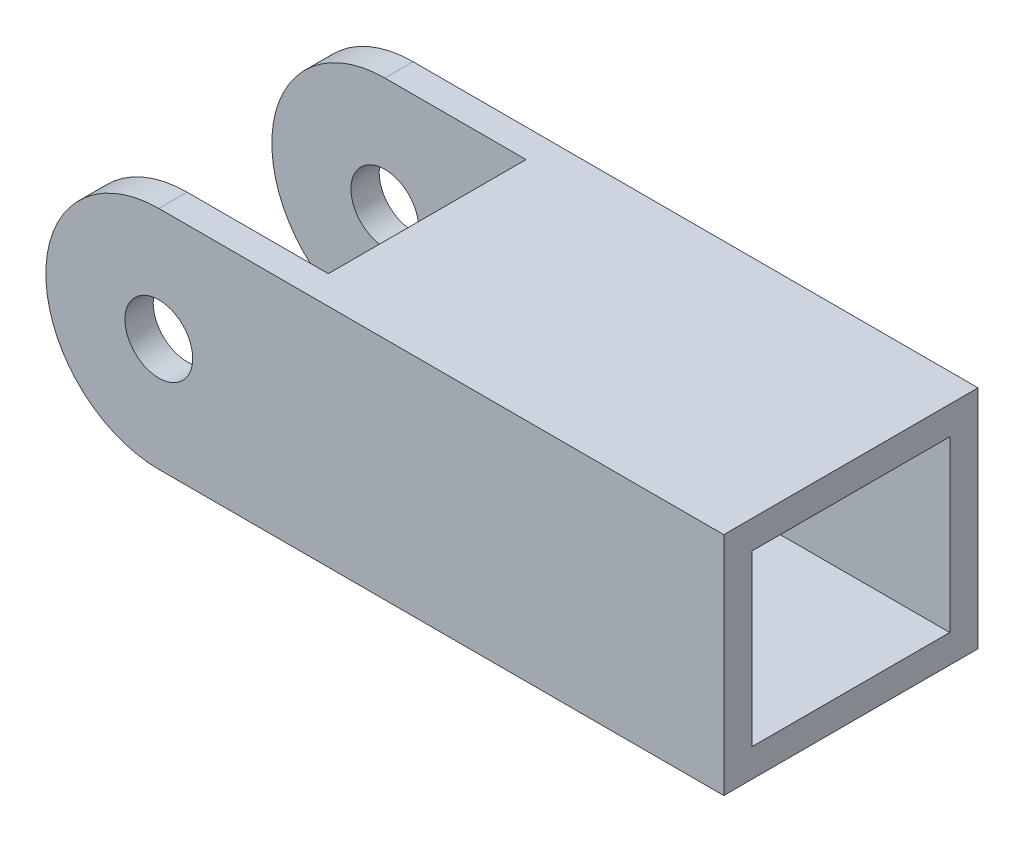
ISO-10303-21;
HEADER;
FILE_DESCRIPTION(('STEP AP214'),'2;1');
FILE_NAME('part.step','',(''),(''),'','','');
FILE_SCHEMA(('AUTOMOTIVE_DESIGN { 1 0 10303 214 1 1 1 1 }'));
ENDSEC;
DATA;
#1=APPLICATION_CONTEXT('core data for automotive mechanical design processes');
#2=APPLICATION_PROTOCOL_DEFINITION('international standard','automotive_design',2000,#1);
#3=PRODUCT_CONTEXT('',#1,'mechanical');
#4=PRODUCT('Part','Part','',(#3));
#5=PRODUCT_RELATED_PRODUCT_CATEGORY('part','',(#4));
#6=PRODUCT_DEFINITION_FORMATION('','',#4);
#7=PRODUCT_DEFINITION_CONTEXT('part definition',#1,'design');
#8=PRODUCT_DEFINITION('design','',#6,#7);
#9=PRODUCT_DEFINITION_SHAPE('','',#8);
#10=(LENGTH_UNIT() NAMED_UNIT(*) SI_UNIT(.MILLI.,.METRE.));
#11=(NAMED_UNIT(*) PLANE_ANGLE_UNIT() SI_UNIT($,.RADIAN.));
#12=(NAMED_UNIT(*) SI_UNIT($,.STERADIAN.) SOLID_ANGLE_UNIT());
#13=UNCERTAINTY_MEASURE_WITH_UNIT(LENGTH_MEASURE(1.E-05),#10,'distance_accuracy_value','');
#14=(GEOMETRIC_REPRESENTATION_CONTEXT(3) GLOBAL_UNCERTAINTY_ASSIGNED_CONTEXT((#13)) GLOBAL_UNIT_ASSIGNED_CONTEXT((#10,
#11,#12)) REPRESENTATION_CONTEXT('',''));
#15=CARTESIAN_POINT('',(0.,0.,0.));
#16=DIRECTION('',(0.,0.,1.));
#17=DIRECTION('',(1.,0.,0.));
#18=AXIS2_PLACEMENT_3D('',#15,#16,#17);
#19=CARTESIAN_POINT('',(-50.,0.,5.));
#20=DIRECTION('',(0.,0.,-1.));
#21=DIRECTION('',(-1.,0.,0.));
#22=AXIS2_PLACEMENT_3D('',#19,#20,#21);
#23=PLANE('',#22);
#24=CARTESIAN_POINT('',(-50.,0.,5.));
#25=DIRECTION('',(0.,0.,-1.));
#26=DIRECTION('',(-1.,0.,0.));
#27=AXIS2_PLACEMENT_3D('',#24,#25,#26);
#28=CIRCLE('',#27,5.99999999999999);
#29=CARTESIAN_POINT('',(-56.,0.,5.));
#30=VERTEX_POINT('',#29);
#31=EDGE_CURVE('E243',#30,#30,#28,.T.);
#32=ORIENTED_EDGE('',*,*,#31,.T.);
#33=EDGE_LOOP('',(#32));
#34=FACE_BOUND('',#33,.T.);
#35=DIRECTION('',(0.,-1.,0.));
#36=VECTOR('',#35,1.);
#37=CARTESIAN_POINT('',(-25.,-15.,5.));
#38=LINE('',#37,#36);
#39=CARTESIAN_POINT('',(-25.,-15.,5.));
#40=VERTEX_POINT('',#39);
#41=CARTESIAN_POINT('',(-25.,-20.,5.));
#42=VERTEX_POINT('',#41);
#43=EDGE_CURVE('E52',#40,#42,#38,.T.);
#44=ORIENTED_EDGE('',*,*,#43,.F.);
#45=DIRECTION('',(-1.,0.,0.));
#46=VECTOR('',#45,1.);
#47=CARTESIAN_POINT('',(50.,-15.,5.));
#48=LINE('',#47,#46);
#49=CARTESIAN_POINT('',(50.,-15.,5.));
#50=VERTEX_POINT('',#49);
#51=EDGE_CURVE('E240',#50,#40,#48,.T.);
#52=ORIENTED_EDGE('',*,*,#51,.F.);
#53=DIRECTION('',(0.,1.,0.));
#54=VECTOR('',#53,1.);
#55=CARTESIAN_POINT('',(50.,-20.,5.));
#56=LINE('',#55,#54);
#57=CARTESIAN_POINT('',(50.,15.,5.));
#58=VERTEX_POINT('',#57);
#59=EDGE_CURVE('E142',#50,#58,#56,.T.);
#60=ORIENTED_EDGE('',*,*,#59,.T.);
#61=DIRECTION('',(-1.,0.,0.));
#62=VECTOR('',#61,1.);
#63=CARTESIAN_POINT('',(50.,15.,5.));
#64=LINE('',#63,#62);
#65=CARTESIAN_POINT('',(-25.,15.,5.));
#66=VERTEX_POINT('',#65);
#67=EDGE_CURVE('E181',#58,#66,#64,.T.);
#68=ORIENTED_EDGE('',*,*,#67,.T.);
#69=DIRECTION('',(0.,1.,0.));
#70=VECTOR('',#69,1.);
#71=CARTESIAN_POINT('',(-25.,15.,5.));
#72=LINE('',#71,#70);
#73=CARTESIAN_POINT('',(-25.,20.,5.));
#74=VERTEX_POINT('',#73);
#75=EDGE_CURVE('E187',#66,#74,#72,.T.);
#76=ORIENTED_EDGE('',*,*,#75,.T.);
#77=DIRECTION('',(1.,0.,0.));
#78=VECTOR('',#77,1.);
#79=CARTESIAN_POINT('',(-50.,20.,5.));
#80=LINE('',#79,#78);
#81=CARTESIAN_POINT('',(-50.,20.,5.));
#82=VERTEX_POINT('',#81);
#83=EDGE_CURVE('E198',#82,#74,#80,.T.);
#84=ORIENTED_EDGE('',*,*,#83,.F.);
#85=CARTESIAN_POINT('',(-50.,0.,5.));
#86=DIRECTION('',(0.,0.,-1.));
#87=DIRECTION('',(-1.,0.,0.));
#88=AXIS2_PLACEMENT_3D('',#85,#86,#87);
#89=CIRCLE('',#88,20.);
#90=CARTESIAN_POINT('',(-50.,-20.,5.));
#91=VERTEX_POINT('',#90);
#92=EDGE_CURVE('E195',#91,#82,#89,.T.);
#93=ORIENTED_EDGE('',*,*,#92,.F.);
#94=DIRECTION('',(1.,0.,0.));
#95=VECTOR('',#94,1.);
#96=CARTESIAN_POINT('',(-50.,-20.,5.));
#97=LINE('',#96,#95);
#98=EDGE_CURVE('E57',#91,#42,#97,.T.);
#99=ORIENTED_EDGE('',*,*,#98,.T.);
#100=EDGE_LOOP('',(#44,#52,#60,#68,#76,#84,#93,#99));
#101=FACE_BOUND('',#100,.T.);
#102=ADVANCED_FACE('F35',(#34,#101),#23,.F.);
#103=CARTESIAN_POINT('',(-50.,0.,40.));
#104=DIRECTION('',(0.,0.,1.));
#105=DIRECTION('',(-1.,0.,0.));
#106=AXIS2_PLACEMENT_3D('',#103,#104,#105);
#107=PLANE('',#106);
#108=CARTESIAN_POINT('',(-50.,0.,40.));
#109=DIRECTION('',(0.,0.,1.));
#110=DIRECTION('',(1.,0.,0.));
#111=AXIS2_PLACEMENT_3D('',#108,#109,#110);
#112=CIRCLE('',#111,5.99999999999999);
#113=CARTESIAN_POINT('',(-56.,0.,40.));
#114=VERTEX_POINT('',#113);
#115=EDGE_CURVE('E248',#114,#114,#112,.T.);
#116=ORIENTED_EDGE('',*,*,#115,.T.);
#117=EDGE_LOOP('',(#116));
#118=FACE_BOUND('',#117,.T.);
#119=DIRECTION('',(0.,-1.,0.));
#120=VECTOR('',#119,1.);
#121=CARTESIAN_POINT('',(-25.,-15.,40.));
#122=LINE('',#121,#120);
#123=CARTESIAN_POINT('',(-25.,-15.,40.));
#124=VERTEX_POINT('',#123);
#125=CARTESIAN_POINT('',(-25.,-20.,40.));
#126=VERTEX_POINT('',#125);
#127=EDGE_CURVE('E238',#124,#126,#122,.T.);
#128=ORIENTED_EDGE('',*,*,#127,.T.);
#129=DIRECTION('',(1.,0.,0.));
#130=VECTOR('',#129,1.);
#131=CARTESIAN_POINT('',(-50.,-20.,40.));
#132=LINE('',#131,#130);
#133=CARTESIAN_POINT('',(-50.,-20.,40.));
#134=VERTEX_POINT('',#133);
#135=EDGE_CURVE('E150',#134,#126,#132,.T.);
#136=ORIENTED_EDGE('',*,*,#135,.F.);
#137=CARTESIAN_POINT('',(-50.,0.,40.));
#138=DIRECTION('',(0.,0.,-1.));
#139=DIRECTION('',(-1.,0.,0.));
#140=AXIS2_PLACEMENT_3D('',#137,#138,#139);
#141=CIRCLE('',#140,20.);
#142=CARTESIAN_POINT('',(-50.,20.,40.));
#143=VERTEX_POINT('',#142);
#144=EDGE_CURVE('E157',#134,#143,#141,.T.);
#145=ORIENTED_EDGE('',*,*,#144,.T.);
#146=DIRECTION('',(1.,0.,0.));
#147=VECTOR('',#146,1.);
#148=CARTESIAN_POINT('',(-50.,20.,40.));
#149=LINE('',#148,#147);
#150=CARTESIAN_POINT('',(-25.,20.,40.));
#151=VERTEX_POINT('',#150);
#152=EDGE_CURVE('E151',#143,#151,#149,.T.);
#153=ORIENTED_EDGE('',*,*,#152,.T.);
#154=DIRECTION('',(0.,1.,0.));
#155=VECTOR('',#154,1.);
#156=CARTESIAN_POINT('',(-25.,15.,40.));
#157=LINE('',#156,#155);
#158=CARTESIAN_POINT('',(-25.,15.,40.));
#159=VERTEX_POINT('',#158);
#160=EDGE_CURVE('E190',#159,#151,#157,.T.);
#161=ORIENTED_EDGE('',*,*,#160,.F.);
#162=DIRECTION('',(1.,0.,0.));
#163=VECTOR('',#162,1.);
#164=CARTESIAN_POINT('',(50.,15.,40.));
#165=LINE('',#164,#163);
#166=CARTESIAN_POINT('',(50.,15.,40.));
#167=VERTEX_POINT('',#166);
#168=EDGE_CURVE('E149',#159,#167,#165,.T.);
#169=ORIENTED_EDGE('',*,*,#168,.T.);
#170=DIRECTION('',(0.,1.,0.));
#171=VECTOR('',#170,1.);
#172=CARTESIAN_POINT('',(50.,-20.,40.));
#173=LINE('',#172,#171);
#174=CARTESIAN_POINT('',(50.,-15.,40.));
#175=VERTEX_POINT('',#174);
#176=EDGE_CURVE('E140',#175,#167,#173,.T.);
#177=ORIENTED_EDGE('',*,*,#176,.F.);
#178=DIRECTION('',(1.,0.,0.));
#179=VECTOR('',#178,1.);
#180=CARTESIAN_POINT('',(50.,-15.,40.));
#181=LINE('',#180,#179);
#182=EDGE_CURVE('E124',#124,#175,#181,.T.);
#183=ORIENTED_EDGE('',*,*,#182,.F.);
#184=EDGE_LOOP('',(#128,#136,#145,#153,#161,#169,#177,#183));
#185=FACE_BOUND('',#184,.T.);
#186=ADVANCED_FACE('F146',(#118,#185),#107,.F.);
#187=CARTESIAN_POINT('',(-50.,0.,5.));
#188=DIRECTION('',(0.,0.,-1.));
#189=DIRECTION('',(-1.,0.,0.));
#190=AXIS2_PLACEMENT_3D('',#187,#188,#189);
#191=CYLINDRICAL_SURFACE('',#190,20.);
#192=CARTESIAN_POINT('',(-50.,0.,0.));
#193=DIRECTION('',(0.,0.,-1.));
#194=DIRECTION('',(-1.,0.,0.));
#195=AXIS2_PLACEMENT_3D('',#192,#193,#194);
#196=CIRCLE('',#195,20.);
#197=CARTESIAN_POINT('',(-50.,-20.,0.));
#198=VERTEX_POINT('',#197);
#199=CARTESIAN_POINT('',(-50.,20.,0.));
#200=VERTEX_POINT('',#199);
#201=EDGE_CURVE('E192',#198,#200,#196,.T.);
#202=ORIENTED_EDGE('',*,*,#201,.F.);
#203=DIRECTION('',(0.,0.,-1.));
#204=VECTOR('',#203,1.);
#205=CARTESIAN_POINT('',(-50.,-20.,5.));
#206=LINE('',#205,#204);
#207=EDGE_CURVE('E11',#91,#198,#206,.T.);
#208=ORIENTED_EDGE('',*,*,#207,.F.);
#209=ORIENTED_EDGE('',*,*,#92,.T.);
#210=DIRECTION('',(0.,0.,-1.));
#211=VECTOR('',#210,1.);
#212=CARTESIAN_POINT('',(-50.,20.,5.));
#213=LINE('',#212,#211);
#214=EDGE_CURVE('E39',#82,#200,#213,.T.);
#215=ORIENTED_EDGE('',*,*,#214,.T.);
#216=EDGE_LOOP('',(#202,#208,#209,#215));
#217=FACE_BOUND('',#216,.T.);
#218=ADVANCED_FACE('F37',(#217),#191,.T.);
#219=CARTESIAN_POINT('',(-50.,-20.,5.));
#220=DIRECTION('',(0.,1.,0.));
#221=DIRECTION('',(0.,0.,1.));
#222=AXIS2_PLACEMENT_3D('',#219,#220,#221);
#223=PLANE('',#222);
#224=DIRECTION('',(1.,0.,0.));
#225=VECTOR('',#224,1.);
#226=CARTESIAN_POINT('',(-50.,-20.,0.));
#227=LINE('',#226,#225);
#228=CARTESIAN_POINT('',(50.,-20.,0.));
#229=VERTEX_POINT('',#228);
#230=EDGE_CURVE('E199',#198,#229,#227,.T.);
#231=ORIENTED_EDGE('',*,*,#230,.T.);
#232=DIRECTION('',(0.,0.,-1.));
#233=VECTOR('',#232,1.);
#234=CARTESIAN_POINT('',(50.,-20.,5.));
#235=LINE('',#234,#233);
#236=CARTESIAN_POINT('',(50.,-20.,45.));
#237=VERTEX_POINT('',#236);
#238=EDGE_CURVE('E44',#237,#229,#235,.T.);
#239=ORIENTED_EDGE('',*,*,#238,.F.);
#240=DIRECTION('',(1.,0.,0.));
#241=VECTOR('',#240,1.);
#242=CARTESIAN_POINT('',(-50.,-20.,45.));
#243=LINE('',#242,#241);
#244=CARTESIAN_POINT('',(-50.,-20.,45.));
#245=VERTEX_POINT('',#244);
#246=EDGE_CURVE('E170',#245,#237,#243,.T.);
#247=ORIENTED_EDGE('',*,*,#246,.F.);
#248=DIRECTION('',(0.,0.,1.));
#249=VECTOR('',#248,1.);
#250=CARTESIAN_POINT('',(-50.,-20.,40.));
#251=LINE('',#250,#249);
#252=EDGE_CURVE('E173',#134,#245,#251,.T.);
#253=ORIENTED_EDGE('',*,*,#252,.F.);
#254=ORIENTED_EDGE('',*,*,#135,.T.);
#255=DIRECTION('',(0.,0.,1.));
#256=VECTOR('',#255,1.);
#257=CARTESIAN_POINT('',(-25.,-20.,40.));
#258=LINE('',#257,#256);
#259=EDGE_CURVE('E143',#42,#126,#258,.T.);
#260=ORIENTED_EDGE('',*,*,#259,.F.);
#261=ORIENTED_EDGE('',*,*,#98,.F.);
#262=ORIENTED_EDGE('',*,*,#207,.T.);
#263=EDGE_LOOP('',(#231,#239,#247,#253,#254,#260,#261,#262));
#264=FACE_BOUND('',#263,.T.);
#265=ADVANCED_FACE('F226',(#264),#223,.F.);
#266=CARTESIAN_POINT('',(50.,-20.,5.));
#267=DIRECTION('',(-1.,0.,0.));
#268=DIRECTION('',(0.,0.,1.));
#269=AXIS2_PLACEMENT_3D('',#266,#267,#268);
#270=PLANE('',#269);
#271=ORIENTED_EDGE('',*,*,#59,.F.);
#272=DIRECTION('',(0.,0.,-1.));
#273=VECTOR('',#272,1.);
#274=CARTESIAN_POINT('',(50.,-15.,40.));
#275=LINE('',#274,#273);
#276=EDGE_CURVE('E127',#175,#50,#275,.T.);
#277=ORIENTED_EDGE('',*,*,#276,.F.);
#278=ORIENTED_EDGE('',*,*,#176,.T.);
#279=DIRECTION('',(0.,0.,-1.));
#280=VECTOR('',#279,1.);
#281=CARTESIAN_POINT('',(50.,15.,40.));
#282=LINE('',#281,#280);
#283=EDGE_CURVE('E179',#167,#58,#282,.T.);
#284=ORIENTED_EDGE('',*,*,#283,.T.);
#285=EDGE_LOOP('',(#271,#277,#278,#284));
#286=FACE_BOUND('',#285,.T.);
#287=DIRECTION('',(0.,1.,0.));
#288=VECTOR('',#287,1.);
#289=CARTESIAN_POINT('',(50.,-20.,0.));
#290=LINE('',#289,#288);
#291=CARTESIAN_POINT('',(50.,20.,0.));
#292=VERTEX_POINT('',#291);
#293=EDGE_CURVE('E209',#229,#292,#290,.T.);
#294=ORIENTED_EDGE('',*,*,#293,.T.);
#295=DIRECTION('',(0.,0.,-1.));
#296=VECTOR('',#295,1.);
#297=CARTESIAN_POINT('',(50.,20.,5.));
#298=LINE('',#297,#296);
#299=CARTESIAN_POINT('',(50.,20.,45.));
#300=VERTEX_POINT('',#299);
#301=EDGE_CURVE('E214',#300,#292,#298,.T.);
#302=ORIENTED_EDGE('',*,*,#301,.F.);
#303=DIRECTION('',(0.,1.,0.));
#304=VECTOR('',#303,1.);
#305=CARTESIAN_POINT('',(50.,-20.,45.));
#306=LINE('',#305,#304);
#307=EDGE_CURVE('E167',#237,#300,#306,.T.);
#308=ORIENTED_EDGE('',*,*,#307,.F.);
#309=ORIENTED_EDGE('',*,*,#238,.T.);
#310=EDGE_LOOP('',(#294,#302,#308,#309));
#311=FACE_BOUND('',#310,.T.);
#312=ADVANCED_FACE('F137',(#286,#311),#270,.F.);
#313=CARTESIAN_POINT('',(-50.,20.,5.));
#314=DIRECTION('',(0.,1.,0.));
#315=DIRECTION('',(0.,0.,1.));
#316=AXIS2_PLACEMENT_3D('',#313,#314,#315);
#317=PLANE('',#316);
#318=DIRECTION('',(1.,0.,0.));
#319=VECTOR('',#318,1.);
#320=CARTESIAN_POINT('',(-50.,20.,0.));
#321=LINE('',#320,#319);
#322=EDGE_CURVE('E206',#200,#292,#321,.T.);
#323=ORIENTED_EDGE('',*,*,#322,.F.);
#324=ORIENTED_EDGE('',*,*,#214,.F.);
#325=ORIENTED_EDGE('',*,*,#83,.T.);
#326=DIRECTION('',(0.,0.,1.));
#327=VECTOR('',#326,1.);
#328=CARTESIAN_POINT('',(-25.,20.,40.));
#329=LINE('',#328,#327);
#330=EDGE_CURVE('E176',#74,#151,#329,.T.);
#331=ORIENTED_EDGE('',*,*,#330,.T.);
#332=ORIENTED_EDGE('',*,*,#152,.F.);
#333=DIRECTION('',(0.,0.,1.));
#334=VECTOR('',#333,1.);
#335=CARTESIAN_POINT('',(-50.,20.,40.));
#336=LINE('',#335,#334);
#337=CARTESIAN_POINT('',(-50.,20.,45.));
#338=VERTEX_POINT('',#337);
#339=EDGE_CURVE('E154',#143,#338,#336,.T.);
#340=ORIENTED_EDGE('',*,*,#339,.T.);
#341=DIRECTION('',(1.,0.,0.));
#342=VECTOR('',#341,1.);
#343=CARTESIAN_POINT('',(-50.,20.,45.));
#344=LINE('',#343,#342);
#345=EDGE_CURVE('E164',#338,#300,#344,.T.);
#346=ORIENTED_EDGE('',*,*,#345,.T.);
#347=ORIENTED_EDGE('',*,*,#301,.T.);
#348=EDGE_LOOP('',(#323,#324,#325,#331,#332,#340,#346,#347));
#349=FACE_BOUND('',#348,.T.);
#350=ADVANCED_FACE('F220',(#349),#317,.T.);
#351=CARTESIAN_POINT('',(-50.,0.,0.));
#352=DIRECTION('',(0.,0.,-1.));
#353=DIRECTION('',(-1.,0.,0.));
#354=AXIS2_PLACEMENT_3D('',#351,#352,#353);
#355=PLANE('',#354);
#356=CARTESIAN_POINT('',(-50.,0.,0.));
#357=DIRECTION('',(0.,0.,-1.));
#358=DIRECTION('',(-1.,0.,0.));
#359=AXIS2_PLACEMENT_3D('',#356,#357,#358);
#360=CIRCLE('',#359,5.99999999999999);
#361=CARTESIAN_POINT('',(-56.,0.,0.));
#362=VERTEX_POINT('',#361);
#363=EDGE_CURVE('E252',#362,#362,#360,.T.);
#364=ORIENTED_EDGE('',*,*,#363,.F.);
#365=EDGE_LOOP('',(#364));
#366=FACE_BOUND('',#365,.T.);
#367=ORIENTED_EDGE('',*,*,#201,.T.);
#368=ORIENTED_EDGE('',*,*,#322,.T.);
#369=ORIENTED_EDGE('',*,*,#293,.F.);
#370=ORIENTED_EDGE('',*,*,#230,.F.);
#371=EDGE_LOOP('',(#367,#368,#369,#370));
#372=FACE_BOUND('',#371,.T.);
#373=ADVANCED_FACE('F224',(#366,#372),#355,.T.);
#374=CARTESIAN_POINT('',(-25.,15.,40.));
#375=DIRECTION('',(-1.,0.,0.));
#376=DIRECTION('',(0.,0.,1.));
#377=AXIS2_PLACEMENT_3D('',#374,#375,#376);
#378=PLANE('',#377);
#379=ORIENTED_EDGE('',*,*,#330,.F.);
#380=ORIENTED_EDGE('',*,*,#75,.F.);
#381=DIRECTION('',(0.,0.,1.));
#382=VECTOR('',#381,1.);
#383=CARTESIAN_POINT('',(-25.,15.,40.));
#384=LINE('',#383,#382);
#385=EDGE_CURVE('E184',#66,#159,#384,.T.);
#386=ORIENTED_EDGE('',*,*,#385,.T.);
#387=ORIENTED_EDGE('',*,*,#160,.T.);
#388=EDGE_LOOP('',(#379,#380,#386,#387));
#389=FACE_BOUND('',#388,.T.);
#390=ADVANCED_FACE('F285',(#389),#378,.T.);
#391=CARTESIAN_POINT('',(0.,15.,0.));
#392=DIRECTION('',(0.,1.,0.));
#393=DIRECTION('',(0.,0.,1.));
#394=AXIS2_PLACEMENT_3D('',#391,#392,#393);
#395=PLANE('',#394);
#396=ORIENTED_EDGE('',*,*,#283,.F.);
#397=ORIENTED_EDGE('',*,*,#168,.F.);
#398=ORIENTED_EDGE('',*,*,#385,.F.);
#399=ORIENTED_EDGE('',*,*,#67,.F.);
#400=EDGE_LOOP('',(#396,#397,#398,#399));
#401=FACE_BOUND('',#400,.T.);
#402=ADVANCED_FACE('F282',(#401),#395,.F.);
#403=CARTESIAN_POINT('',(-50.,0.,40.));
#404=DIRECTION('',(0.,0.,1.));
#405=DIRECTION('',(-1.,0.,0.));
#406=AXIS2_PLACEMENT_3D('',#403,#404,#405);
#407=CYLINDRICAL_SURFACE('',#406,20.);
#408=CARTESIAN_POINT('',(-50.,0.,45.));
#409=DIRECTION('',(0.,0.,-1.));
#410=DIRECTION('',(-1.,0.,0.));
#411=AXIS2_PLACEMENT_3D('',#408,#409,#410);
#412=CIRCLE('',#411,20.);
#413=EDGE_CURVE('E161',#245,#338,#412,.T.);
#414=ORIENTED_EDGE('',*,*,#413,.T.);
#415=ORIENTED_EDGE('',*,*,#339,.F.);
#416=ORIENTED_EDGE('',*,*,#144,.F.);
#417=ORIENTED_EDGE('',*,*,#252,.T.);
#418=EDGE_LOOP('',(#414,#415,#416,#417));
#419=FACE_BOUND('',#418,.T.);
#420=ADVANCED_FACE('F234',(#419),#407,.T.);
#421=CARTESIAN_POINT('',(-50.,0.,45.));
#422=DIRECTION('',(0.,0.,1.));
#423=DIRECTION('',(-1.,0.,0.));
#424=AXIS2_PLACEMENT_3D('',#421,#422,#423);
#425=PLANE('',#424);
#426=CARTESIAN_POINT('',(-50.,0.,45.));
#427=DIRECTION('',(0.,0.,-1.));
#428=DIRECTION('',(-1.,0.,0.));
#429=AXIS2_PLACEMENT_3D('',#426,#427,#428);
#430=CIRCLE('',#429,5.99999999999999);
#431=CARTESIAN_POINT('',(-56.,0.,45.));
#432=VERTEX_POINT('',#431);
#433=EDGE_CURVE('E251',#432,#432,#430,.T.);
#434=ORIENTED_EDGE('',*,*,#433,.T.);
#435=EDGE_LOOP('',(#434));
#436=FACE_BOUND('',#435,.T.);
#437=ORIENTED_EDGE('',*,*,#413,.F.);
#438=ORIENTED_EDGE('',*,*,#246,.T.);
#439=ORIENTED_EDGE('',*,*,#307,.T.);
#440=ORIENTED_EDGE('',*,*,#345,.F.);
#441=EDGE_LOOP('',(#437,#438,#439,#440));
#442=FACE_BOUND('',#441,.T.);
#443=ADVANCED_FACE('F230',(#436,#442),#425,.T.);
#444=CARTESIAN_POINT('',(-25.,-15.,40.));
#445=DIRECTION('',(1.,0.,0.));
#446=DIRECTION('',(0.,0.,-1.));
#447=AXIS2_PLACEMENT_3D('',#444,#445,#446);
#448=PLANE('',#447);
#449=ORIENTED_EDGE('',*,*,#259,.T.);
#450=ORIENTED_EDGE('',*,*,#127,.F.);
#451=DIRECTION('',(0.,0.,1.));
#452=VECTOR('',#451,1.);
#453=CARTESIAN_POINT('',(-25.,-15.,40.));
#454=LINE('',#453,#452);
#455=EDGE_CURVE('E129',#40,#124,#454,.T.);
#456=ORIENTED_EDGE('',*,*,#455,.F.);
#457=ORIENTED_EDGE('',*,*,#43,.T.);
#458=EDGE_LOOP('',(#449,#450,#456,#457));
#459=FACE_BOUND('',#458,.T.);
#460=ADVANCED_FACE('F276',(#459),#448,.F.);
#461=CARTESIAN_POINT('',(0.,-15.,0.));
#462=DIRECTION('',(0.,-1.,0.));
#463=DIRECTION('',(0.,0.,1.));
#464=AXIS2_PLACEMENT_3D('',#461,#462,#463);
#465=PLANE('',#464);
#466=ORIENTED_EDGE('',*,*,#276,.T.);
#467=ORIENTED_EDGE('',*,*,#51,.T.);
#468=ORIENTED_EDGE('',*,*,#455,.T.);
#469=ORIENTED_EDGE('',*,*,#182,.T.);
#470=EDGE_LOOP('',(#466,#467,#468,#469));
#471=FACE_BOUND('',#470,.T.);
#472=ADVANCED_FACE('F126',(#471),#465,.F.);
#473=CARTESIAN_POINT('',(-50.,0.,45.));
#474=DIRECTION('',(0.,0.,-1.));
#475=DIRECTION('',(-1.,0.,0.));
#476=AXIS2_PLACEMENT_3D('',#473,#474,#475);
#477=CYLINDRICAL_SURFACE('',#476,5.99999999999999);
#478=CARTESIAN_POINT('',(-56.,0.,45.));
#479=CARTESIAN_POINT('',(-56.,0.,44.9479166666667));
#480=CARTESIAN_POINT('',(-56.,0.,44.8958333333333));
#481=CARTESIAN_POINT('',(-56.,0.,44.7916666666667));
#482=CARTESIAN_POINT('',(-56.,0.,44.7395833333333));
#483=CARTESIAN_POINT('',(-56.,0.,44.6354166666667));
#484=CARTESIAN_POINT('',(-56.,0.,44.5833333333333));
#485=CARTESIAN_POINT('',(-56.,0.,44.4791666666667));
#486=CARTESIAN_POINT('',(-56.,0.,44.4270833333333));
#487=CARTESIAN_POINT('',(-56.,0.,44.3229166666667));
#488=CARTESIAN_POINT('',(-56.,0.,44.2708333333333));
#489=CARTESIAN_POINT('',(-56.,0.,44.1666666666667));
#490=CARTESIAN_POINT('',(-56.,0.,44.1145833333333));
#491=CARTESIAN_POINT('',(-56.,0.,44.0104166666667));
#492=CARTESIAN_POINT('',(-56.,0.,43.9583333333333));
#493=CARTESIAN_POINT('',(-56.,0.,43.8541666666667));
#494=CARTESIAN_POINT('',(-56.,0.,43.8020833333333));
#495=CARTESIAN_POINT('',(-56.,0.,43.6979166666667));
#496=CARTESIAN_POINT('',(-56.,0.,43.6458333333333));
#497=CARTESIAN_POINT('',(-56.,0.,43.5416666666667));
#498=CARTESIAN_POINT('',(-56.,0.,43.4895833333333));
#499=CARTESIAN_POINT('',(-56.,0.,43.3854166666667));
#500=CARTESIAN_POINT('',(-56.,0.,43.3333333333333));
#501=CARTESIAN_POINT('',(-56.,0.,43.2291666666667));
#502=CARTESIAN_POINT('',(-56.,0.,43.1770833333333));
#503=CARTESIAN_POINT('',(-56.,0.,43.0729166666667));
#504=CARTESIAN_POINT('',(-56.,0.,43.0208333333333));
#505=CARTESIAN_POINT('',(-56.,0.,42.9166666666667));
#506=CARTESIAN_POINT('',(-56.,0.,42.8645833333333));
#507=CARTESIAN_POINT('',(-56.,0.,42.7604166666667));
#508=CARTESIAN_POINT('',(-56.,0.,42.7083333333333));
#509=CARTESIAN_POINT('',(-56.,0.,42.6041666666667));
#510=CARTESIAN_POINT('',(-56.,0.,42.5520833333333));
#511=CARTESIAN_POINT('',(-56.,0.,42.4479166666667));
#512=CARTESIAN_POINT('',(-56.,0.,42.3958333333333));
#513=CARTESIAN_POINT('',(-56.,0.,42.2916666666667));
#514=CARTESIAN_POINT('',(-56.,0.,42.2395833333333));
#515=CARTESIAN_POINT('',(-56.,0.,42.1354166666667));
#516=CARTESIAN_POINT('',(-56.,0.,42.0833333333333));
#517=CARTESIAN_POINT('',(-56.,0.,41.9791666666667));
#518=CARTESIAN_POINT('',(-56.,0.,41.9270833333333));
#519=CARTESIAN_POINT('',(-56.,0.,41.8229166666667));
#520=CARTESIAN_POINT('',(-56.,0.,41.7708333333333));
#521=CARTESIAN_POINT('',(-56.,0.,41.6666666666667));
#522=CARTESIAN_POINT('',(-56.,0.,41.6145833333333));
#523=CARTESIAN_POINT('',(-56.,0.,41.5104166666667));
#524=CARTESIAN_POINT('',(-56.,0.,41.4583333333333));
#525=CARTESIAN_POINT('',(-56.,0.,41.3541666666667));
#526=CARTESIAN_POINT('',(-56.,0.,41.3020833333333));
#527=CARTESIAN_POINT('',(-56.,0.,41.1979166666667));
#528=CARTESIAN_POINT('',(-56.,0.,41.1458333333333));
#529=CARTESIAN_POINT('',(-56.,0.,41.0416666666667));
#530=CARTESIAN_POINT('',(-56.,0.,40.9895833333333));
#531=CARTESIAN_POINT('',(-56.,0.,40.8854166666667));
#532=CARTESIAN_POINT('',(-56.,0.,40.8333333333333));
#533=CARTESIAN_POINT('',(-56.,0.,40.7291666666667));
#534=CARTESIAN_POINT('',(-56.,0.,40.6770833333333));
#535=CARTESIAN_POINT('',(-56.,0.,40.5729166666667));
#536=CARTESIAN_POINT('',(-56.,0.,40.5208333333333));
#537=CARTESIAN_POINT('',(-56.,0.,40.4166666666667));
#538=CARTESIAN_POINT('',(-56.,0.,40.3645833333333));
#539=CARTESIAN_POINT('',(-56.,0.,40.2604166666667));
#540=CARTESIAN_POINT('',(-56.,0.,40.2083333333333));
#541=CARTESIAN_POINT('',(-56.,0.,40.1041666666667));
#542=CARTESIAN_POINT('',(-56.,0.,40.0520833333333));
#543=CARTESIAN_POINT('',(-56.,0.,40.));
#544=B_SPLINE_CURVE_WITH_KNOTS('',3,(#478,#479,#480,#481,#482,#483,#484,#485,#486,#487,#488,
#489,#490,#491,#492,#493,#494,#495,#496,#497,#498,#499,#500,#501,#502,#503,#504,#505,#506,#507,
#508,#509,#510,#511,#512,#513,#514,#515,#516,#517,#518,#519,#520,#521,#522,#523,#524,#525,#526,
#527,#528,#529,#530,#531,#532,#533,#534,#535,#536,#537,#538,#539,#540,#541,#542,#543),
.UNSPECIFIED.,.F.,.F.,(4,2,2,2,2,2,2,2,2,2,2,2,2,2,2,2,2,2,2,2,2,2,2,2,2,2,2,2,2,2,2,2,4),(0.,
0.156250000000004,0.312500000000007,0.468750000000004,0.625000000000008,0.781250000000004,
0.937500000000008,1.09375,1.25000000000001,1.40625,1.56250000000001,1.71875,1.87500000000001,
2.03125000000001,2.18750000000001,2.34375000000001,2.50000000000001,2.65625000000001,
2.81250000000001,2.96875000000001,3.12500000000001,3.28125000000001,3.43750000000001,
3.59375000000001,3.75000000000001,3.90625000000001,4.06250000000001,4.21875000000001,
4.37500000000001,4.53125000000001,4.68750000000001,4.84375000000001,5.00000000000001),.UNSPECIFIED.);
#545=EDGE_CURVE('BSEAM259',#432,#114,#544,.T.);
#546=ORIENTED_EDGE('',*,*,#433,.F.);
#547=ORIENTED_EDGE('',*,*,#115,.F.);
#548=ORIENTED_EDGE('',*,*,#545,.T.);
#549=ORIENTED_EDGE('',*,*,#545,.F.);
#550=EDGE_LOOP('',(#546,#548,#547,#549));
#551=FACE_BOUND('',#550,.T.);
#552=ADVANCED_FACE('F259',(#551),#477,.F.);
#553=CARTESIAN_POINT('',(-56.,0.,0.));
#554=CARTESIAN_POINT('',(-56.,0.,0.0520833333333322));
#555=CARTESIAN_POINT('',(-56.,0.,0.104166666666664));
#556=CARTESIAN_POINT('',(-56.,0.,0.208333333333331));
#557=CARTESIAN_POINT('',(-56.,0.,0.260416666666666));
#558=CARTESIAN_POINT('',(-56.,0.,0.364583333333335));
#559=CARTESIAN_POINT('',(-56.,0.,0.416666666666669));
#560=CARTESIAN_POINT('',(-56.,0.,0.520833333333336));
#561=CARTESIAN_POINT('',(-56.,0.,0.572916666666668));
#562=CARTESIAN_POINT('',(-56.,0.,0.677083333333333));
#563=CARTESIAN_POINT('',(-56.,0.,0.729166666666665));
#564=CARTESIAN_POINT('',(-56.,0.,0.833333333333332));
#565=CARTESIAN_POINT('',(-56.,0.,0.885416666666666));
#566=CARTESIAN_POINT('',(-56.,0.,0.989583333333335));
#567=CARTESIAN_POINT('',(-56.,0.,1.04166666666667));
#568=CARTESIAN_POINT('',(-56.,0.,1.14583333333334));
#569=CARTESIAN_POINT('',(-56.,0.,1.19791666666667));
#570=CARTESIAN_POINT('',(-56.,0.,1.30208333333333));
#571=CARTESIAN_POINT('',(-56.,0.,1.35416666666667));
#572=CARTESIAN_POINT('',(-56.,0.,1.45833333333333));
#573=CARTESIAN_POINT('',(-56.,0.,1.51041666666667));
#574=CARTESIAN_POINT('',(-56.,0.,1.61458333333334));
#575=CARTESIAN_POINT('',(-56.,0.,1.66666666666667));
#576=CARTESIAN_POINT('',(-56.,0.,1.77083333333334));
#577=CARTESIAN_POINT('',(-56.,0.,1.82291666666667));
#578=CARTESIAN_POINT('',(-56.,0.,1.92708333333333));
#579=CARTESIAN_POINT('',(-56.,0.,1.97916666666667));
#580=CARTESIAN_POINT('',(-56.,0.,2.08333333333333));
#581=CARTESIAN_POINT('',(-56.,0.,2.13541666666667));
#582=CARTESIAN_POINT('',(-56.,0.,2.23958333333334));
#583=CARTESIAN_POINT('',(-56.,0.,2.29166666666667));
#584=CARTESIAN_POINT('',(-56.,0.,2.39583333333334));
#585=CARTESIAN_POINT('',(-56.,0.,2.44791666666667));
#586=CARTESIAN_POINT('',(-56.,0.,2.55208333333333));
#587=CARTESIAN_POINT('',(-56.,0.,2.60416666666667));
#588=CARTESIAN_POINT('',(-56.,0.,2.70833333333333));
#589=CARTESIAN_POINT('',(-56.,0.,2.76041666666667));
#590=CARTESIAN_POINT('',(-56.,0.,2.86458333333334));
#591=CARTESIAN_POINT('',(-56.,0.,2.91666666666667));
#592=CARTESIAN_POINT('',(-56.,0.,3.02083333333334));
#593=CARTESIAN_POINT('',(-56.,0.,3.07291666666667));
#594=CARTESIAN_POINT('',(-56.,0.,3.17708333333334));
#595=CARTESIAN_POINT('',(-56.,0.,3.22916666666667));
#596=CARTESIAN_POINT('',(-56.,0.,3.33333333333333));
#597=CARTESIAN_POINT('',(-56.,0.,3.38541666666667));
#598=CARTESIAN_POINT('',(-56.,0.,3.48958333333334));
#599=CARTESIAN_POINT('',(-56.,0.,3.54166666666667));
#600=CARTESIAN_POINT('',(-56.,0.,3.64583333333334));
#601=CARTESIAN_POINT('',(-56.,0.,3.69791666666667));
#602=CARTESIAN_POINT('',(-56.,0.,3.80208333333334));
#603=CARTESIAN_POINT('',(-56.,0.,3.85416666666667));
#604=CARTESIAN_POINT('',(-56.,0.,3.95833333333333));
#605=CARTESIAN_POINT('',(-56.,0.,4.01041666666667));
#606=CARTESIAN_POINT('',(-56.,0.,4.11458333333334));
#607=CARTESIAN_POINT('',(-56.,0.,4.16666666666667));
#608=CARTESIAN_POINT('',(-56.,0.,4.27083333333334));
#609=CARTESIAN_POINT('',(-56.,0.,4.32291666666667));
#610=CARTESIAN_POINT('',(-56.,0.,4.42708333333334));
#611=CARTESIAN_POINT('',(-56.,0.,4.47916666666667));
#612=CARTESIAN_POINT('',(-56.,0.,4.58333333333333));
#613=CARTESIAN_POINT('',(-56.,0.,4.63541666666667));
#614=CARTESIAN_POINT('',(-56.,0.,4.73958333333334));
#615=CARTESIAN_POINT('',(-56.,0.,4.79166666666667));
#616=CARTESIAN_POINT('',(-56.,0.,4.89583333333334));
#617=CARTESIAN_POINT('',(-56.,0.,4.94791666666667));
#618=CARTESIAN_POINT('',(-56.,0.,5.));
#619=B_SPLINE_CURVE_WITH_KNOTS('',3,(#553,#554,#555,#556,#557,#558,#559,#560,#561,#562,#563,
#564,#565,#566,#567,#568,#569,#570,#571,#572,#573,#574,#575,#576,#577,#578,#579,#580,#581,#582,
#583,#584,#585,#586,#587,#588,#589,#590,#591,#592,#593,#594,#595,#596,#597,#598,#599,#600,#601,
#602,#603,#604,#605,#606,#607,#608,#609,#610,#611,#612,#613,#614,#615,#616,#617,#618),
.UNSPECIFIED.,.F.,.F.,(4,2,2,2,2,2,2,2,2,2,2,2,2,2,2,2,2,2,2,2,2,2,2,2,2,2,2,2,2,2,2,2,4),(0.,
0.156249999999997,0.3125,0.468750000000004,0.625000000000001,0.781249999999997,
0.937500000000001,1.09375,1.25,1.40625,1.5625,1.71875,1.875,2.03125,2.1875,2.34375000000001,2.5,
2.65625,2.8125,2.96875000000001,3.125,3.28125,3.4375,3.59375000000001,3.75,3.90625,4.0625,
4.21875000000001,4.375,4.53125,4.6875,4.84375000000001,5.),.UNSPECIFIED.);
#620=EDGE_CURVE('BSEAM262',#362,#30,#619,.T.);
#621=ORIENTED_EDGE('',*,*,#363,.T.);
#622=ORIENTED_EDGE('',*,*,#31,.F.);
#623=ORIENTED_EDGE('',*,*,#620,.T.);
#624=ORIENTED_EDGE('',*,*,#620,.F.);
#625=EDGE_LOOP('',(#621,#623,#622,#624));
#626=FACE_BOUND('',#625,.T.);
#627=ADVANCED_FACE('F262',(#626),#477,.F.);
#628=CLOSED_SHELL('',(#102,#186,#218,#265,#312,#350,#373,#390,#402,#420,#443,#460,#472,#552,#627));
#629=MANIFOLD_SOLID_BREP('B2',#628);
#630=ADVANCED_BREP_SHAPE_REPRESENTATION('',(#18,#629),#14);
#631=SHAPE_DEFINITION_REPRESENTATION(#9,#630);
ENDSEC;
END-ISO-10303-21;
